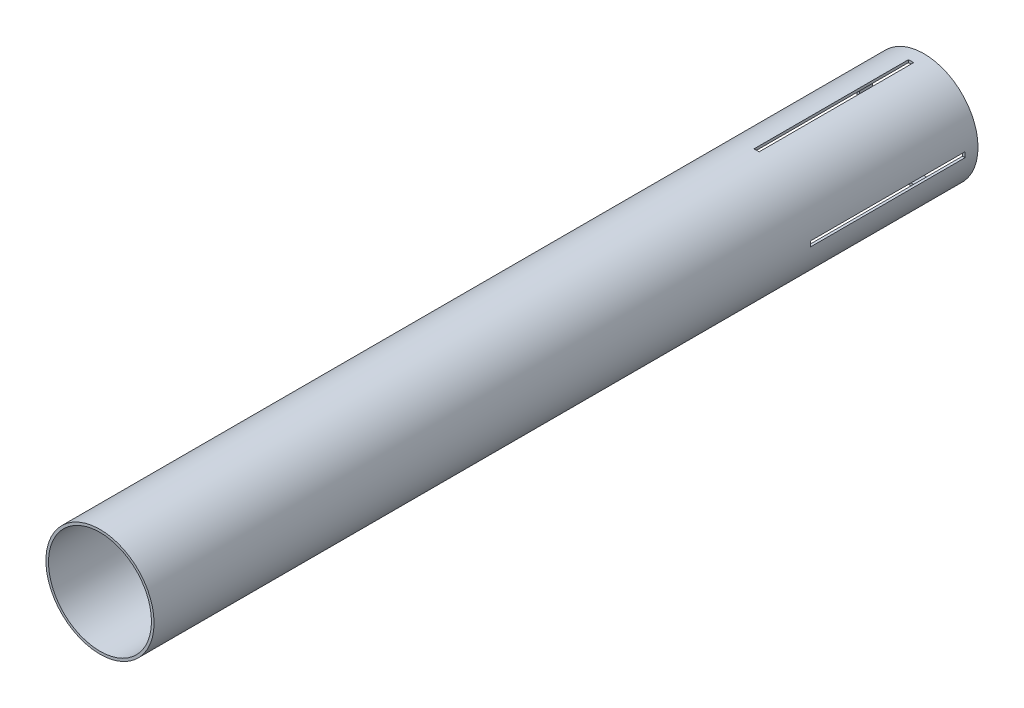
ISO-10303-21;
HEADER;
FILE_DESCRIPTION(('STEP AP214'),'2;1');
FILE_NAME('part.step','',(''),(''),'','','');
FILE_SCHEMA(('AUTOMOTIVE_DESIGN { 1 0 10303 214 1 1 1 1 }'));
ENDSEC;
DATA;
#1=APPLICATION_CONTEXT('core data for automotive mechanical design processes');
#2=APPLICATION_PROTOCOL_DEFINITION('international standard','automotive_design',2000,#1);
#3=PRODUCT_CONTEXT('',#1,'mechanical');
#4=PRODUCT('Part','Part','',(#3));
#5=PRODUCT_RELATED_PRODUCT_CATEGORY('part','',(#4));
#6=PRODUCT_DEFINITION_FORMATION('','',#4);
#7=PRODUCT_DEFINITION_CONTEXT('part definition',#1,'design');
#8=PRODUCT_DEFINITION('design','',#6,#7);
#9=PRODUCT_DEFINITION_SHAPE('','',#8);
#10=(LENGTH_UNIT() NAMED_UNIT(*) SI_UNIT(.MILLI.,.METRE.));
#11=(NAMED_UNIT(*) PLANE_ANGLE_UNIT() SI_UNIT($,.RADIAN.));
#12=(NAMED_UNIT(*) SI_UNIT($,.STERADIAN.) SOLID_ANGLE_UNIT());
#13=UNCERTAINTY_MEASURE_WITH_UNIT(LENGTH_MEASURE(1.E-05),#10,'distance_accuracy_value','');
#14=(GEOMETRIC_REPRESENTATION_CONTEXT(3) GLOBAL_UNCERTAINTY_ASSIGNED_CONTEXT((#13)) GLOBAL_UNIT_ASSIGNED_CONTEXT((#10,
#11,#12)) REPRESENTATION_CONTEXT('',''));
#15=CARTESIAN_POINT('',(0.,0.,0.));
#16=DIRECTION('',(0.,0.,1.));
#17=DIRECTION('',(1.,0.,0.));
#18=AXIS2_PLACEMENT_3D('',#15,#16,#17);
#19=CARTESIAN_POINT('',(0.,0.,812.8));
#20=DIRECTION('',(0.,0.,1.));
#21=DIRECTION('',(1.,0.,0.));
#22=AXIS2_PLACEMENT_3D('',#19,#20,#21);
#23=PLANE('',#22);
#24=CARTESIAN_POINT('',(0.,0.,812.8));
#25=DIRECTION('',(0.,0.,1.));
#26=DIRECTION('',(1.,0.,0.));
#27=AXIS2_PLACEMENT_3D('',#24,#25,#26);
#28=CIRCLE('',#27,53.34);
#29=CARTESIAN_POINT('',(53.34,0.,812.8));
#30=VERTEX_POINT('',#29);
#31=EDGE_CURVE('E11',#30,#30,#28,.T.);
#32=ORIENTED_EDGE('',*,*,#31,.T.);
#33=EDGE_LOOP('',(#32));
#34=FACE_BOUND('',#33,.T.);
#35=CARTESIAN_POINT('',(0.,0.,812.8));
#36=DIRECTION('',(0.,0.,1.));
#37=DIRECTION('',(1.,0.,0.));
#38=AXIS2_PLACEMENT_3D('',#35,#36,#37);
#39=CIRCLE('',#38,50.8);
#40=CARTESIAN_POINT('',(50.8,0.,812.8));
#41=VERTEX_POINT('',#40);
#42=EDGE_CURVE('E347',#41,#41,#39,.T.);
#43=ORIENTED_EDGE('',*,*,#42,.F.);
#44=EDGE_LOOP('',(#43));
#45=FACE_BOUND('',#44,.T.);
#46=ADVANCED_FACE('F44',(#34,#45),#23,.T.);
#47=CARTESIAN_POINT('',(0.,0.,0.));
#48=DIRECTION('',(0.,0.,1.));
#49=DIRECTION('',(1.,0.,0.));
#50=AXIS2_PLACEMENT_3D('',#47,#48,#49);
#51=PLANE('',#50);
#52=CARTESIAN_POINT('',(0.,0.,0.));
#53=DIRECTION('',(0.,0.,1.));
#54=DIRECTION('',(1.,0.,0.));
#55=AXIS2_PLACEMENT_3D('',#52,#53,#54);
#56=CIRCLE('',#55,53.34);
#57=CARTESIAN_POINT('',(53.34,0.,0.));
#58=VERTEX_POINT('',#57);
#59=EDGE_CURVE('E48',#58,#58,#56,.T.);
#60=ORIENTED_EDGE('',*,*,#59,.F.);
#61=EDGE_LOOP('',(#60));
#62=FACE_BOUND('',#61,.T.);
#63=CARTESIAN_POINT('',(0.,0.,0.));
#64=DIRECTION('',(0.,0.,1.));
#65=DIRECTION('',(1.,0.,0.));
#66=AXIS2_PLACEMENT_3D('',#63,#64,#65);
#67=CIRCLE('',#66,50.8);
#68=CARTESIAN_POINT('',(50.8,0.,0.));
#69=VERTEX_POINT('',#68);
#70=EDGE_CURVE('E346',#69,#69,#67,.T.);
#71=ORIENTED_EDGE('',*,*,#70,.T.);
#72=EDGE_LOOP('',(#71));
#73=FACE_BOUND('',#72,.T.);
#74=ADVANCED_FACE('F355',(#62,#73),#51,.F.);
#75=CARTESIAN_POINT('',(0.,0.,812.8));
#76=DIRECTION('',(0.,0.,-1.));
#77=DIRECTION('',(-1.,0.,0.));
#78=AXIS2_PLACEMENT_3D('',#75,#76,#77);
#79=CYLINDRICAL_SURFACE('',#78,53.34);
#80=DIRECTION('',(0.,0.,-1.));
#81=VECTOR('',#80,1.);
#82=CARTESIAN_POINT('',(2.54000000000021,-53.2794894870437,812.8));
#83=LINE('',#82,#81);
#84=CARTESIAN_POINT('',(2.54000000000019,-53.2794894870437,12.7));
#85=VERTEX_POINT('',#84);
#86=CARTESIAN_POINT('',(2.54000000000019,-53.2794894870437,165.1));
#87=VERTEX_POINT('',#86);
#88=EDGE_CURVE('E198',#85,#87,#83,.F.);
#89=ORIENTED_EDGE('',*,*,#88,.F.);
#90=CARTESIAN_POINT('',(0.,0.,12.7));
#91=DIRECTION('',(0.,0.,-1.));
#92=DIRECTION('',(-1.,0.,0.));
#93=AXIS2_PLACEMENT_3D('',#90,#91,#92);
#94=CIRCLE('',#93,53.34);
#95=CARTESIAN_POINT('',(-2.53999999999979,-53.2794894870437,12.7));
#96=VERTEX_POINT('',#95);
#97=EDGE_CURVE('E202',#96,#85,#94,.F.);
#98=ORIENTED_EDGE('',*,*,#97,.F.);
#99=DIRECTION('',(0.,0.,-1.));
#100=VECTOR('',#99,1.);
#101=CARTESIAN_POINT('',(-2.53999999999979,-53.2794894870437,812.8));
#102=LINE('',#101,#100);
#103=CARTESIAN_POINT('',(-2.53999999999979,-53.2794894870437,165.1));
#104=VERTEX_POINT('',#103);
#105=EDGE_CURVE('E170',#104,#96,#102,.T.);
#106=ORIENTED_EDGE('',*,*,#105,.F.);
#107=CARTESIAN_POINT('',(0.,0.,165.1));
#108=DIRECTION('',(0.,0.,1.));
#109=DIRECTION('',(1.,0.,0.));
#110=AXIS2_PLACEMENT_3D('',#107,#108,#109);
#111=CIRCLE('',#110,53.34);
#112=EDGE_CURVE('E60',#87,#104,#111,.F.);
#113=ORIENTED_EDGE('',*,*,#112,.F.);
#114=EDGE_LOOP('',(#89,#98,#106,#113));
#115=FACE_BOUND('',#114,.T.);
#116=DIRECTION('',(0.,0.,-1.));
#117=VECTOR('',#116,1.);
#118=CARTESIAN_POINT('',(53.2794894870437,2.54000000000003,812.8));
#119=LINE('',#118,#117);
#120=CARTESIAN_POINT('',(53.2794894870437,2.54,12.7));
#121=VERTEX_POINT('',#120);
#122=CARTESIAN_POINT('',(53.2794894870437,2.54000000000001,165.1));
#123=VERTEX_POINT('',#122);
#124=EDGE_CURVE('E231',#121,#123,#119,.F.);
#125=ORIENTED_EDGE('',*,*,#124,.F.);
#126=CARTESIAN_POINT('',(0.,0.,12.7));
#127=DIRECTION('',(0.,0.,-1.));
#128=DIRECTION('',(-1.,0.,0.));
#129=AXIS2_PLACEMENT_3D('',#126,#127,#128);
#130=CIRCLE('',#129,53.34);
#131=CARTESIAN_POINT('',(53.2794894870437,-2.53999999999997,12.7));
#132=VERTEX_POINT('',#131);
#133=EDGE_CURVE('E235',#132,#121,#130,.F.);
#134=ORIENTED_EDGE('',*,*,#133,.F.);
#135=DIRECTION('',(0.,0.,-1.));
#136=VECTOR('',#135,1.);
#137=CARTESIAN_POINT('',(53.2794894870437,-2.53999999999997,812.8));
#138=LINE('',#137,#136);
#139=CARTESIAN_POINT('',(53.2794894870437,-2.53999999999997,165.1));
#140=VERTEX_POINT('',#139);
#141=EDGE_CURVE('E184',#140,#132,#138,.T.);
#142=ORIENTED_EDGE('',*,*,#141,.F.);
#143=CARTESIAN_POINT('',(0.,0.,165.1));
#144=DIRECTION('',(0.,0.,1.));
#145=DIRECTION('',(1.,0.,0.));
#146=AXIS2_PLACEMENT_3D('',#143,#144,#145);
#147=CIRCLE('',#146,53.34);
#148=EDGE_CURVE('E68',#123,#140,#147,.F.);
#149=ORIENTED_EDGE('',*,*,#148,.F.);
#150=EDGE_LOOP('',(#125,#134,#142,#149));
#151=FACE_BOUND('',#150,.T.);
#152=DIRECTION('',(0.,0.,-1.));
#153=VECTOR('',#152,1.);
#154=CARTESIAN_POINT('',(-2.54000000000059,53.2794894870437,812.8));
#155=LINE('',#154,#153);
#156=CARTESIAN_POINT('',(-2.54000000000056,53.2794894870437,12.7));
#157=VERTEX_POINT('',#156);
#158=CARTESIAN_POINT('',(-2.54000000000056,53.2794894870437,165.1));
#159=VERTEX_POINT('',#158);
#160=EDGE_CURVE('E271',#157,#159,#155,.F.);
#161=ORIENTED_EDGE('',*,*,#160,.F.);
#162=CARTESIAN_POINT('',(0.,0.,12.7));
#163=DIRECTION('',(0.,0.,-1.));
#164=DIRECTION('',(-1.,0.,0.));
#165=AXIS2_PLACEMENT_3D('',#162,#163,#164);
#166=CIRCLE('',#165,53.34);
#167=CARTESIAN_POINT('',(2.53999999999942,53.2794894870437,12.7));
#168=VERTEX_POINT('',#167);
#169=EDGE_CURVE('E275',#168,#157,#166,.F.);
#170=ORIENTED_EDGE('',*,*,#169,.F.);
#171=DIRECTION('',(0.,0.,-1.));
#172=VECTOR('',#171,1.);
#173=CARTESIAN_POINT('',(2.53999999999942,53.2794894870437,812.8));
#174=LINE('',#173,#172);
#175=CARTESIAN_POINT('',(2.53999999999942,53.2794894870437,165.1));
#176=VERTEX_POINT('',#175);
#177=EDGE_CURVE('E221',#176,#168,#174,.T.);
#178=ORIENTED_EDGE('',*,*,#177,.F.);
#179=CARTESIAN_POINT('',(0.,0.,165.1));
#180=DIRECTION('',(0.,0.,1.));
#181=DIRECTION('',(1.,0.,0.));
#182=AXIS2_PLACEMENT_3D('',#179,#180,#181);
#183=CIRCLE('',#182,53.34);
#184=EDGE_CURVE('E268',#159,#176,#183,.F.);
#185=ORIENTED_EDGE('',*,*,#184,.F.);
#186=EDGE_LOOP('',(#161,#170,#178,#185));
#187=FACE_BOUND('',#186,.T.);
#188=DIRECTION('',(0.,0.,-1.));
#189=VECTOR('',#188,1.);
#190=CARTESIAN_POINT('',(-53.2794894870437,-2.54000000000003,812.8));
#191=LINE('',#190,#189);
#192=CARTESIAN_POINT('',(-53.2794894870437,-2.54,12.7));
#193=VERTEX_POINT('',#192);
#194=CARTESIAN_POINT('',(-53.2794894870437,-2.54000000000001,165.1));
#195=VERTEX_POINT('',#194);
#196=EDGE_CURVE('E315',#193,#195,#191,.F.);
#197=ORIENTED_EDGE('',*,*,#196,.F.);
#198=CARTESIAN_POINT('',(0.,0.,12.7));
#199=DIRECTION('',(0.,0.,-1.));
#200=DIRECTION('',(-1.,0.,0.));
#201=AXIS2_PLACEMENT_3D('',#198,#199,#200);
#202=CIRCLE('',#201,53.34);
#203=CARTESIAN_POINT('',(-53.2794894870437,2.53999999999997,12.7));
#204=VERTEX_POINT('',#203);
#205=EDGE_CURVE('E319',#204,#193,#202,.F.);
#206=ORIENTED_EDGE('',*,*,#205,.F.);
#207=DIRECTION('',(0.,0.,-1.));
#208=VECTOR('',#207,1.);
#209=CARTESIAN_POINT('',(-53.2794894870437,2.53999999999997,812.8));
#210=LINE('',#209,#208);
#211=CARTESIAN_POINT('',(-53.2794894870437,2.53999999999997,165.1));
#212=VERTEX_POINT('',#211);
#213=EDGE_CURVE('E342',#212,#204,#210,.T.);
#214=ORIENTED_EDGE('',*,*,#213,.F.);
#215=CARTESIAN_POINT('',(0.,0.,165.1));
#216=DIRECTION('',(0.,0.,1.));
#217=DIRECTION('',(1.,0.,0.));
#218=AXIS2_PLACEMENT_3D('',#215,#216,#217);
#219=CIRCLE('',#218,53.34);
#220=EDGE_CURVE('E312',#195,#212,#219,.F.);
#221=ORIENTED_EDGE('',*,*,#220,.F.);
#222=EDGE_LOOP('',(#197,#206,#214,#221));
#223=FACE_BOUND('',#222,.T.);
#224=ORIENTED_EDGE('',*,*,#31,.F.);
#225=EDGE_LOOP('',(#224));
#226=FACE_BOUND('',#225,.T.);
#227=ORIENTED_EDGE('',*,*,#59,.T.);
#228=EDGE_LOOP('',(#227));
#229=FACE_BOUND('',#228,.T.);
#230=ADVANCED_FACE('F46',(#115,#151,#187,#223,#226,#229),#79,.T.);
#231=CARTESIAN_POINT('',(0.,0.,812.8));
#232=DIRECTION('',(0.,0.,-1.));
#233=DIRECTION('',(-1.,0.,0.));
#234=AXIS2_PLACEMENT_3D('',#231,#232,#233);
#235=CYLINDRICAL_SURFACE('',#234,50.8);
#236=CARTESIAN_POINT('',(0.,0.,12.7));
#237=DIRECTION('',(0.,0.,-1.));
#238=DIRECTION('',(-1.,0.,0.));
#239=AXIS2_PLACEMENT_3D('',#236,#237,#238);
#240=CIRCLE('',#239,50.8);
#241=CARTESIAN_POINT('',(-2.5399999999998,-50.736460262813,12.7));
#242=VERTEX_POINT('',#241);
#243=CARTESIAN_POINT('',(2.5400000000002,-50.736460262813,12.7));
#244=VERTEX_POINT('',#243);
#245=EDGE_CURVE('E188',#242,#244,#240,.F.);
#246=ORIENTED_EDGE('',*,*,#245,.T.);
#247=DIRECTION('',(0.,0.,-1.));
#248=VECTOR('',#247,1.);
#249=CARTESIAN_POINT('',(2.5400000000002,-50.736460262813,812.8));
#250=LINE('',#249,#248);
#251=CARTESIAN_POINT('',(2.54000000000018,-50.736460262813,165.1));
#252=VERTEX_POINT('',#251);
#253=EDGE_CURVE('E182',#244,#252,#250,.F.);
#254=ORIENTED_EDGE('',*,*,#253,.T.);
#255=CARTESIAN_POINT('',(0.,0.,165.1));
#256=DIRECTION('',(0.,0.,1.));
#257=DIRECTION('',(1.,0.,0.));
#258=AXIS2_PLACEMENT_3D('',#255,#256,#257);
#259=CIRCLE('',#258,50.8);
#260=CARTESIAN_POINT('',(-2.5399999999998,-50.736460262813,165.1));
#261=VERTEX_POINT('',#260);
#262=EDGE_CURVE('E174',#252,#261,#259,.F.);
#263=ORIENTED_EDGE('',*,*,#262,.T.);
#264=DIRECTION('',(0.,0.,-1.));
#265=VECTOR('',#264,1.);
#266=CARTESIAN_POINT('',(-2.5399999999998,-50.736460262813,812.8));
#267=LINE('',#266,#265);
#268=EDGE_CURVE('E159',#261,#242,#267,.T.);
#269=ORIENTED_EDGE('',*,*,#268,.T.);
#270=EDGE_LOOP('',(#246,#254,#263,#269));
#271=FACE_BOUND('',#270,.T.);
#272=CARTESIAN_POINT('',(0.,0.,12.7));
#273=DIRECTION('',(0.,0.,-1.));
#274=DIRECTION('',(-1.,0.,0.));
#275=AXIS2_PLACEMENT_3D('',#272,#273,#274);
#276=CIRCLE('',#275,50.8);
#277=CARTESIAN_POINT('',(50.736460262813,-2.53999999999997,12.7));
#278=VERTEX_POINT('',#277);
#279=CARTESIAN_POINT('',(50.736460262813,2.54000000000003,12.7));
#280=VERTEX_POINT('',#279);
#281=EDGE_CURVE('E225',#278,#280,#276,.F.);
#282=ORIENTED_EDGE('',*,*,#281,.T.);
#283=DIRECTION('',(0.,0.,-1.));
#284=VECTOR('',#283,1.);
#285=CARTESIAN_POINT('',(50.736460262813,2.54000000000003,812.8));
#286=LINE('',#285,#284);
#287=CARTESIAN_POINT('',(50.736460262813,2.54000000000001,165.1));
#288=VERTEX_POINT('',#287);
#289=EDGE_CURVE('E220',#280,#288,#286,.F.);
#290=ORIENTED_EDGE('',*,*,#289,.T.);
#291=CARTESIAN_POINT('',(0.,0.,165.1));
#292=DIRECTION('',(0.,0.,1.));
#293=DIRECTION('',(1.,0.,0.));
#294=AXIS2_PLACEMENT_3D('',#291,#292,#293);
#295=CIRCLE('',#294,50.8);
#296=CARTESIAN_POINT('',(50.736460262813,-2.53999999999997,165.1));
#297=VERTEX_POINT('',#296);
#298=EDGE_CURVE('E216',#288,#297,#295,.F.);
#299=ORIENTED_EDGE('',*,*,#298,.T.);
#300=DIRECTION('',(0.,0.,-1.));
#301=VECTOR('',#300,1.);
#302=CARTESIAN_POINT('',(50.736460262813,-2.53999999999997,812.8));
#303=LINE('',#302,#301);
#304=EDGE_CURVE('E191',#297,#278,#303,.T.);
#305=ORIENTED_EDGE('',*,*,#304,.T.);
#306=EDGE_LOOP('',(#282,#290,#299,#305));
#307=FACE_BOUND('',#306,.T.);
#308=CARTESIAN_POINT('',(0.,0.,12.7));
#309=DIRECTION('',(0.,0.,-1.));
#310=DIRECTION('',(-1.,0.,0.));
#311=AXIS2_PLACEMENT_3D('',#308,#309,#310);
#312=CIRCLE('',#311,50.8);
#313=CARTESIAN_POINT('',(2.53999999999944,50.736460262813,12.7));
#314=VERTEX_POINT('',#313);
#315=CARTESIAN_POINT('',(-2.54000000000056,50.7364602628129,12.7));
#316=VERTEX_POINT('',#315);
#317=EDGE_CURVE('E264',#314,#316,#312,.F.);
#318=ORIENTED_EDGE('',*,*,#317,.T.);
#319=DIRECTION('',(0.,0.,-1.));
#320=VECTOR('',#319,1.);
#321=CARTESIAN_POINT('',(-2.54000000000056,50.7364602628129,812.8));
#322=LINE('',#321,#320);
#323=CARTESIAN_POINT('',(-2.54000000000054,50.7364602628129,165.1));
#324=VERTEX_POINT('',#323);
#325=EDGE_CURVE('E260',#316,#324,#322,.F.);
#326=ORIENTED_EDGE('',*,*,#325,.T.);
#327=CARTESIAN_POINT('',(0.,0.,165.1));
#328=DIRECTION('',(0.,0.,1.));
#329=DIRECTION('',(1.,0.,0.));
#330=AXIS2_PLACEMENT_3D('',#327,#328,#329);
#331=CIRCLE('',#330,50.8);
#332=CARTESIAN_POINT('',(2.53999999999944,50.736460262813,165.1));
#333=VERTEX_POINT('',#332);
#334=EDGE_CURVE('E256',#324,#333,#331,.F.);
#335=ORIENTED_EDGE('',*,*,#334,.T.);
#336=DIRECTION('',(0.,0.,-1.));
#337=VECTOR('',#336,1.);
#338=CARTESIAN_POINT('',(2.53999999999944,50.736460262813,812.8));
#339=LINE('',#338,#337);
#340=EDGE_CURVE('E284',#333,#314,#339,.T.);
#341=ORIENTED_EDGE('',*,*,#340,.T.);
#342=EDGE_LOOP('',(#318,#326,#335,#341));
#343=FACE_BOUND('',#342,.T.);
#344=CARTESIAN_POINT('',(0.,0.,12.7));
#345=DIRECTION('',(0.,0.,-1.));
#346=DIRECTION('',(-1.,0.,0.));
#347=AXIS2_PLACEMENT_3D('',#344,#345,#346);
#348=CIRCLE('',#347,50.8);
#349=CARTESIAN_POINT('',(-50.736460262813,2.53999999999997,12.7));
#350=VERTEX_POINT('',#349);
#351=CARTESIAN_POINT('',(-50.736460262813,-2.54000000000003,12.7));
#352=VERTEX_POINT('',#351);
#353=EDGE_CURVE('E308',#350,#352,#348,.F.);
#354=ORIENTED_EDGE('',*,*,#353,.T.);
#355=DIRECTION('',(0.,0.,-1.));
#356=VECTOR('',#355,1.);
#357=CARTESIAN_POINT('',(-50.736460262813,-2.54000000000003,812.8));
#358=LINE('',#357,#356);
#359=CARTESIAN_POINT('',(-50.736460262813,-2.54000000000001,165.1));
#360=VERTEX_POINT('',#359);
#361=EDGE_CURVE('E304',#352,#360,#358,.F.);
#362=ORIENTED_EDGE('',*,*,#361,.T.);
#363=CARTESIAN_POINT('',(0.,0.,165.1));
#364=DIRECTION('',(0.,0.,1.));
#365=DIRECTION('',(1.,0.,0.));
#366=AXIS2_PLACEMENT_3D('',#363,#364,#365);
#367=CIRCLE('',#366,50.8);
#368=CARTESIAN_POINT('',(-50.736460262813,2.53999999999997,165.1));
#369=VERTEX_POINT('',#368);
#370=EDGE_CURVE('E215',#360,#369,#367,.F.);
#371=ORIENTED_EDGE('',*,*,#370,.T.);
#372=DIRECTION('',(0.,0.,-1.));
#373=VECTOR('',#372,1.);
#374=CARTESIAN_POINT('',(-50.736460262813,2.53999999999997,812.8));
#375=LINE('',#374,#373);
#376=EDGE_CURVE('E328',#369,#350,#375,.T.);
#377=ORIENTED_EDGE('',*,*,#376,.T.);
#378=EDGE_LOOP('',(#354,#362,#371,#377));
#379=FACE_BOUND('',#378,.T.);
#380=ORIENTED_EDGE('',*,*,#42,.T.);
#381=EDGE_LOOP('',(#380));
#382=FACE_BOUND('',#381,.T.);
#383=ORIENTED_EDGE('',*,*,#70,.F.);
#384=EDGE_LOOP('',(#383));
#385=FACE_BOUND('',#384,.T.);
#386=ADVANCED_FACE('F180',(#271,#307,#343,#379,#382,#385),#235,.F.);
#387=CARTESIAN_POINT('',(-53.341,-2.54,12.7));
#388=DIRECTION('',(0.,0.,-1.));
#389=DIRECTION('',(-1.,0.,0.));
#390=AXIS2_PLACEMENT_3D('',#387,#388,#389);
#391=PLANE('',#390);
#392=ORIENTED_EDGE('',*,*,#205,.T.);
#393=DIRECTION('',(1.,0.,0.));
#394=VECTOR('',#393,1.);
#395=CARTESIAN_POINT('',(-53.341,-2.54,12.7));
#396=LINE('',#395,#394);
#397=EDGE_CURVE('E324',#193,#352,#396,.T.);
#398=ORIENTED_EDGE('',*,*,#397,.T.);
#399=ORIENTED_EDGE('',*,*,#353,.F.);
#400=DIRECTION('',(1.,0.,0.));
#401=VECTOR('',#400,1.);
#402=CARTESIAN_POINT('',(-53.341,2.54,12.7));
#403=LINE('',#402,#401);
#404=EDGE_CURVE('E323',#204,#350,#403,.T.);
#405=ORIENTED_EDGE('',*,*,#404,.F.);
#406=EDGE_LOOP('',(#392,#398,#399,#405));
#407=FACE_BOUND('',#406,.T.);
#408=ADVANCED_FACE('F358',(#407),#391,.F.);
#409=CARTESIAN_POINT('',(-53.341,-2.54000000000001,165.1));
#410=DIRECTION('',(0.,-1.,0.));
#411=DIRECTION('',(0.,0.,-1.));
#412=AXIS2_PLACEMENT_3D('',#409,#410,#411);
#413=PLANE('',#412);
#414=ORIENTED_EDGE('',*,*,#196,.T.);
#415=DIRECTION('',(1.,0.,0.));
#416=VECTOR('',#415,1.);
#417=CARTESIAN_POINT('',(-53.341,-2.54000000000001,165.1));
#418=LINE('',#417,#416);
#419=EDGE_CURVE('E329',#195,#360,#418,.T.);
#420=ORIENTED_EDGE('',*,*,#419,.T.);
#421=ORIENTED_EDGE('',*,*,#361,.F.);
#422=ORIENTED_EDGE('',*,*,#397,.F.);
#423=EDGE_LOOP('',(#414,#420,#421,#422));
#424=FACE_BOUND('',#423,.T.);
#425=ADVANCED_FACE('F365',(#424),#413,.F.);
#426=CARTESIAN_POINT('',(-53.341,-2.54000000000001,165.1));
#427=DIRECTION('',(0.,0.,1.));
#428=DIRECTION('',(1.,0.,0.));
#429=AXIS2_PLACEMENT_3D('',#426,#427,#428);
#430=PLANE('',#429);
#431=ORIENTED_EDGE('',*,*,#220,.T.);
#432=DIRECTION('',(1.,0.,0.));
#433=VECTOR('',#432,1.);
#434=CARTESIAN_POINT('',(-53.341,2.53999999999999,165.1));
#435=LINE('',#434,#433);
#436=EDGE_CURVE('E333',#212,#369,#435,.T.);
#437=ORIENTED_EDGE('',*,*,#436,.T.);
#438=ORIENTED_EDGE('',*,*,#370,.F.);
#439=ORIENTED_EDGE('',*,*,#419,.F.);
#440=EDGE_LOOP('',(#431,#437,#438,#439));
#441=FACE_BOUND('',#440,.T.);
#442=ADVANCED_FACE('F400',(#441),#430,.F.);
#443=CARTESIAN_POINT('',(-53.341,2.53999999999999,165.1));
#444=DIRECTION('',(0.,1.,0.));
#445=DIRECTION('',(0.,0.,1.));
#446=AXIS2_PLACEMENT_3D('',#443,#444,#445);
#447=PLANE('',#446);
#448=ORIENTED_EDGE('',*,*,#213,.T.);
#449=ORIENTED_EDGE('',*,*,#404,.T.);
#450=ORIENTED_EDGE('',*,*,#376,.F.);
#451=ORIENTED_EDGE('',*,*,#436,.F.);
#452=EDGE_LOOP('',(#448,#449,#450,#451));
#453=FACE_BOUND('',#452,.T.);
#454=ADVANCED_FACE('F409',(#453),#447,.F.);
#455=CARTESIAN_POINT('',(-2.54000000000056,53.3410000000005,12.7));
#456=DIRECTION('',(0.,0.,-1.));
#457=DIRECTION('',(-1.,0.,0.));
#458=AXIS2_PLACEMENT_3D('',#455,#456,#457);
#459=PLANE('',#458);
#460=ORIENTED_EDGE('',*,*,#169,.T.);
#461=DIRECTION('',(0.,-1.,0.));
#462=VECTOR('',#461,1.);
#463=CARTESIAN_POINT('',(-2.54000000000056,53.3410000000005,12.7));
#464=LINE('',#463,#462);
#465=EDGE_CURVE('E280',#157,#316,#464,.T.);
#466=ORIENTED_EDGE('',*,*,#465,.T.);
#467=ORIENTED_EDGE('',*,*,#317,.F.);
#468=DIRECTION('',(0.,-1.,0.));
#469=VECTOR('',#468,1.);
#470=CARTESIAN_POINT('',(2.53999999999944,53.3410000000006,12.7));
#471=LINE('',#470,#469);
#472=EDGE_CURVE('E279',#168,#314,#471,.T.);
#473=ORIENTED_EDGE('',*,*,#472,.F.);
#474=EDGE_LOOP('',(#460,#466,#467,#473));
#475=FACE_BOUND('',#474,.T.);
#476=ADVANCED_FACE('F417',(#475),#459,.F.);
#477=CARTESIAN_POINT('',(-2.54000000000057,53.3410000000005,165.1));
#478=DIRECTION('',(-1.,0.,0.));
#479=DIRECTION('',(0.,-1.,0.));
#480=AXIS2_PLACEMENT_3D('',#477,#478,#479);
#481=PLANE('',#480);
#482=ORIENTED_EDGE('',*,*,#160,.T.);
#483=DIRECTION('',(0.,-1.,0.));
#484=VECTOR('',#483,1.);
#485=CARTESIAN_POINT('',(-2.54000000000057,53.3410000000005,165.1));
#486=LINE('',#485,#484);
#487=EDGE_CURVE('E285',#159,#324,#486,.T.);
#488=ORIENTED_EDGE('',*,*,#487,.T.);
#489=ORIENTED_EDGE('',*,*,#325,.F.);
#490=ORIENTED_EDGE('',*,*,#465,.F.);
#491=EDGE_LOOP('',(#482,#488,#489,#490));
#492=FACE_BOUND('',#491,.T.);
#493=ADVANCED_FACE('F440',(#492),#481,.F.);
#494=CARTESIAN_POINT('',(-2.54000000000057,53.3410000000005,165.1));
#495=DIRECTION('',(0.,0.,1.));
#496=DIRECTION('',(1.,0.,0.));
#497=AXIS2_PLACEMENT_3D('',#494,#495,#496);
#498=PLANE('',#497);
#499=ORIENTED_EDGE('',*,*,#184,.T.);
#500=DIRECTION('',(0.,-1.,0.));
#501=VECTOR('',#500,1.);
#502=CARTESIAN_POINT('',(2.53999999999944,53.3410000000006,165.1));
#503=LINE('',#502,#501);
#504=EDGE_CURVE('E289',#176,#333,#503,.T.);
#505=ORIENTED_EDGE('',*,*,#504,.T.);
#506=ORIENTED_EDGE('',*,*,#334,.F.);
#507=ORIENTED_EDGE('',*,*,#487,.F.);
#508=EDGE_LOOP('',(#499,#505,#506,#507));
#509=FACE_BOUND('',#508,.T.);
#510=ADVANCED_FACE('F449',(#509),#498,.F.);
#511=CARTESIAN_POINT('',(2.53999999999944,53.3410000000006,165.1));
#512=DIRECTION('',(1.,0.,0.));
#513=DIRECTION('',(0.,1.,0.));
#514=AXIS2_PLACEMENT_3D('',#511,#512,#513);
#515=PLANE('',#514);
#516=ORIENTED_EDGE('',*,*,#177,.T.);
#517=ORIENTED_EDGE('',*,*,#472,.T.);
#518=ORIENTED_EDGE('',*,*,#340,.F.);
#519=ORIENTED_EDGE('',*,*,#504,.F.);
#520=EDGE_LOOP('',(#516,#517,#518,#519));
#521=FACE_BOUND('',#520,.T.);
#522=ADVANCED_FACE('F458',(#521),#515,.F.);
#523=CARTESIAN_POINT('',(53.341,2.54,12.7));
#524=DIRECTION('',(0.,0.,-1.));
#525=DIRECTION('',(-1.,0.,0.));
#526=AXIS2_PLACEMENT_3D('',#523,#524,#525);
#527=PLANE('',#526);
#528=ORIENTED_EDGE('',*,*,#133,.T.);
#529=DIRECTION('',(-1.,0.,0.));
#530=VECTOR('',#529,1.);
#531=CARTESIAN_POINT('',(53.341,2.54,12.7));
#532=LINE('',#531,#530);
#533=EDGE_CURVE('E240',#121,#280,#532,.T.);
#534=ORIENTED_EDGE('',*,*,#533,.T.);
#535=ORIENTED_EDGE('',*,*,#281,.F.);
#536=DIRECTION('',(-1.,0.,0.));
#537=VECTOR('',#536,1.);
#538=CARTESIAN_POINT('',(53.341,-2.54,12.7));
#539=LINE('',#538,#537);
#540=EDGE_CURVE('E239',#132,#278,#539,.T.);
#541=ORIENTED_EDGE('',*,*,#540,.F.);
#542=EDGE_LOOP('',(#528,#534,#535,#541));
#543=FACE_BOUND('',#542,.T.);
#544=ADVANCED_FACE('F467',(#543),#527,.F.);
#545=CARTESIAN_POINT('',(53.341,2.54000000000001,165.1));
#546=DIRECTION('',(0.,1.,0.));
#547=DIRECTION('',(0.,0.,1.));
#548=AXIS2_PLACEMENT_3D('',#545,#546,#547);
#549=PLANE('',#548);
#550=ORIENTED_EDGE('',*,*,#124,.T.);
#551=DIRECTION('',(-1.,0.,0.));
#552=VECTOR('',#551,1.);
#553=CARTESIAN_POINT('',(53.341,2.54000000000001,165.1));
#554=LINE('',#553,#552);
#555=EDGE_CURVE('E244',#123,#288,#554,.T.);
#556=ORIENTED_EDGE('',*,*,#555,.T.);
#557=ORIENTED_EDGE('',*,*,#289,.F.);
#558=ORIENTED_EDGE('',*,*,#533,.F.);
#559=EDGE_LOOP('',(#550,#556,#557,#558));
#560=FACE_BOUND('',#559,.T.);
#561=ADVANCED_FACE('F476',(#560),#549,.F.);
#562=CARTESIAN_POINT('',(53.341,2.54000000000001,165.1));
#563=DIRECTION('',(0.,0.,1.));
#564=DIRECTION('',(1.,0.,0.));
#565=AXIS2_PLACEMENT_3D('',#562,#563,#564);
#566=PLANE('',#565);
#567=ORIENTED_EDGE('',*,*,#148,.T.);
#568=DIRECTION('',(-1.,0.,0.));
#569=VECTOR('',#568,1.);
#570=CARTESIAN_POINT('',(53.341,-2.53999999999999,165.1));
#571=LINE('',#570,#569);
#572=EDGE_CURVE('E248',#140,#297,#571,.T.);
#573=ORIENTED_EDGE('',*,*,#572,.T.);
#574=ORIENTED_EDGE('',*,*,#298,.F.);
#575=ORIENTED_EDGE('',*,*,#555,.F.);
#576=EDGE_LOOP('',(#567,#573,#574,#575));
#577=FACE_BOUND('',#576,.T.);
#578=ADVANCED_FACE('F485',(#577),#566,.F.);
#579=CARTESIAN_POINT('',(53.341,-2.53999999999999,165.1));
#580=DIRECTION('',(0.,-1.,0.));
#581=DIRECTION('',(0.,0.,-1.));
#582=AXIS2_PLACEMENT_3D('',#579,#580,#581);
#583=PLANE('',#582);
#584=ORIENTED_EDGE('',*,*,#141,.T.);
#585=ORIENTED_EDGE('',*,*,#540,.T.);
#586=ORIENTED_EDGE('',*,*,#304,.F.);
#587=ORIENTED_EDGE('',*,*,#572,.F.);
#588=EDGE_LOOP('',(#584,#585,#586,#587));
#589=FACE_BOUND('',#588,.T.);
#590=ADVANCED_FACE('F494',(#589),#583,.F.);
#591=CARTESIAN_POINT('',(2.54000000000019,-53.3410000000002,12.7));
#592=DIRECTION('',(0.,0.,-1.));
#593=DIRECTION('',(-1.,0.,0.));
#594=AXIS2_PLACEMENT_3D('',#591,#592,#593);
#595=PLANE('',#594);
#596=ORIENTED_EDGE('',*,*,#97,.T.);
#597=DIRECTION('',(0.,1.,0.));
#598=VECTOR('',#597,1.);
#599=CARTESIAN_POINT('',(2.54000000000019,-53.3410000000002,12.7));
#600=LINE('',#599,#598);
#601=EDGE_CURVE('E171',#85,#244,#600,.T.);
#602=ORIENTED_EDGE('',*,*,#601,.T.);
#603=ORIENTED_EDGE('',*,*,#245,.F.);
#604=DIRECTION('',(0.,1.,0.));
#605=VECTOR('',#604,1.);
#606=CARTESIAN_POINT('',(-2.53999999999981,-53.3410000000002,12.7));
#607=LINE('',#606,#605);
#608=EDGE_CURVE('E164',#96,#242,#607,.T.);
#609=ORIENTED_EDGE('',*,*,#608,.F.);
#610=EDGE_LOOP('',(#596,#602,#603,#609));
#611=FACE_BOUND('',#610,.T.);
#612=ADVANCED_FACE('F502',(#611),#595,.F.);
#613=CARTESIAN_POINT('',(2.54000000000019,-53.3410000000002,165.1));
#614=DIRECTION('',(1.,0.,0.));
#615=DIRECTION('',(0.,1.,0.));
#616=AXIS2_PLACEMENT_3D('',#613,#614,#615);
#617=PLANE('',#616);
#618=ORIENTED_EDGE('',*,*,#88,.T.);
#619=DIRECTION('',(0.,1.,0.));
#620=VECTOR('',#619,1.);
#621=CARTESIAN_POINT('',(2.54000000000019,-53.3410000000002,165.1));
#622=LINE('',#621,#620);
#623=EDGE_CURVE('E177',#87,#252,#622,.T.);
#624=ORIENTED_EDGE('',*,*,#623,.T.);
#625=ORIENTED_EDGE('',*,*,#253,.F.);
#626=ORIENTED_EDGE('',*,*,#601,.F.);
#627=EDGE_LOOP('',(#618,#624,#625,#626));
#628=FACE_BOUND('',#627,.T.);
#629=ADVANCED_FACE('F511',(#628),#617,.F.);
#630=CARTESIAN_POINT('',(2.54000000000019,-53.3410000000002,165.1));
#631=DIRECTION('',(0.,0.,1.));
#632=DIRECTION('',(1.,0.,0.));
#633=AXIS2_PLACEMENT_3D('',#630,#631,#632);
#634=PLANE('',#633);
#635=ORIENTED_EDGE('',*,*,#112,.T.);
#636=DIRECTION('',(0.,1.,0.));
#637=VECTOR('',#636,1.);
#638=CARTESIAN_POINT('',(-2.53999999999981,-53.3410000000002,165.1));
#639=LINE('',#638,#637);
#640=EDGE_CURVE('E162',#104,#261,#639,.T.);
#641=ORIENTED_EDGE('',*,*,#640,.T.);
#642=ORIENTED_EDGE('',*,*,#262,.F.);
#643=ORIENTED_EDGE('',*,*,#623,.F.);
#644=EDGE_LOOP('',(#635,#641,#642,#643));
#645=FACE_BOUND('',#644,.T.);
#646=ADVANCED_FACE('F173',(#645),#634,.F.);
#647=CARTESIAN_POINT('',(-2.53999999999981,-53.3410000000002,165.1));
#648=DIRECTION('',(-1.,0.,0.));
#649=DIRECTION('',(0.,-1.,0.));
#650=AXIS2_PLACEMENT_3D('',#647,#648,#649);
#651=PLANE('',#650);
#652=ORIENTED_EDGE('',*,*,#105,.T.);
#653=ORIENTED_EDGE('',*,*,#608,.T.);
#654=ORIENTED_EDGE('',*,*,#268,.F.);
#655=ORIENTED_EDGE('',*,*,#640,.F.);
#656=EDGE_LOOP('',(#652,#653,#654,#655));
#657=FACE_BOUND('',#656,.T.);
#658=ADVANCED_FACE('F161',(#657),#651,.F.);
#659=CLOSED_SHELL('',(#46,#74,#230,#386,#408,#425,#442,#454,#476,#493,#510,#522,#544,#561,#578,
#590,#612,#629,#646,#658));
#660=MANIFOLD_SOLID_BREP('B2',#659);
#661=ADVANCED_BREP_SHAPE_REPRESENTATION('',(#18,#660),#14);
#662=SHAPE_DEFINITION_REPRESENTATION(#9,#661);
ENDSEC;
END-ISO-10303-21;
